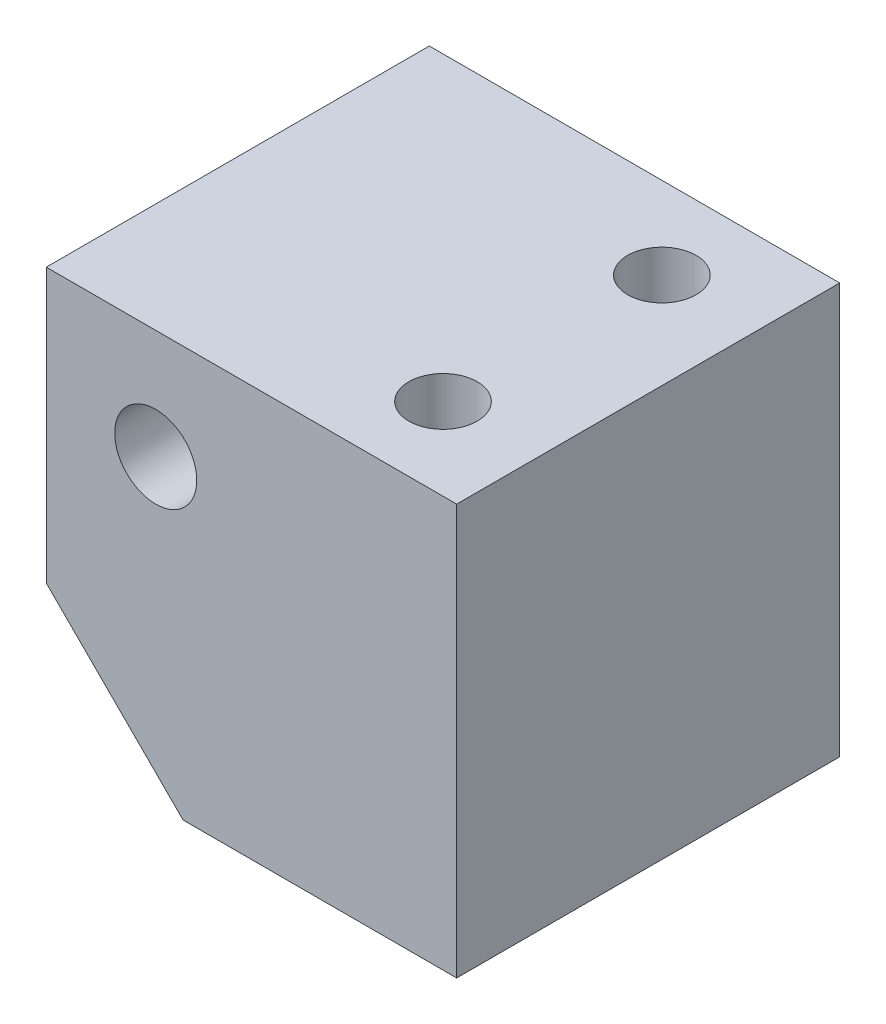
ISO-10303-21;
HEADER;
FILE_DESCRIPTION(('STEP AP214'),'2;1');
FILE_NAME('part.step','',(''),(''),'','','');
FILE_SCHEMA(('AUTOMOTIVE_DESIGN { 1 0 10303 214 1 1 1 1 }'));
ENDSEC;
DATA;
#1=APPLICATION_CONTEXT('core data for automotive mechanical design processes');
#2=APPLICATION_PROTOCOL_DEFINITION('international standard','automotive_design',2000,#1);
#3=PRODUCT_CONTEXT('',#1,'mechanical');
#4=PRODUCT('Part','Part','',(#3));
#5=PRODUCT_RELATED_PRODUCT_CATEGORY('part','',(#4));
#6=PRODUCT_DEFINITION_FORMATION('','',#4);
#7=PRODUCT_DEFINITION_CONTEXT('part definition',#1,'design');
#8=PRODUCT_DEFINITION('design','',#6,#7);
#9=PRODUCT_DEFINITION_SHAPE('','',#8);
#10=(LENGTH_UNIT() NAMED_UNIT(*) SI_UNIT(.MILLI.,.METRE.));
#11=(NAMED_UNIT(*) PLANE_ANGLE_UNIT() SI_UNIT($,.RADIAN.));
#12=(NAMED_UNIT(*) SI_UNIT($,.STERADIAN.) SOLID_ANGLE_UNIT());
#13=UNCERTAINTY_MEASURE_WITH_UNIT(LENGTH_MEASURE(1.E-05),#10,'distance_accuracy_value','');
#14=(GEOMETRIC_REPRESENTATION_CONTEXT(3) GLOBAL_UNCERTAINTY_ASSIGNED_CONTEXT((#13)) GLOBAL_UNIT_ASSIGNED_CONTEXT((#10,
#11,#12)) REPRESENTATION_CONTEXT('',''));
#15=CARTESIAN_POINT('',(0.,0.,0.));
#16=DIRECTION('',(0.,0.,1.));
#17=DIRECTION('',(1.,0.,0.));
#18=AXIS2_PLACEMENT_3D('',#15,#16,#17);
#19=CARTESIAN_POINT('',(-7.5,-7.5,14.));
#20=DIRECTION('',(0.707106781186548,0.707106781186548,0.));
#21=DIRECTION('',(-0.707106781186548,0.707106781186547,0.));
#22=AXIS2_PLACEMENT_3D('',#19,#20,#21);
#23=PLANE('',#22);
#24=DIRECTION('',(0.707106781186548,-0.707106781186547,0.));
#25=VECTOR('',#24,1.);
#26=CARTESIAN_POINT('',(-7.5,-7.5,0.));
#27=LINE('',#26,#25);
#28=CARTESIAN_POINT('',(-5.,-10.,0.));
#29=VERTEX_POINT('',#28);
#30=CARTESIAN_POINT('',(0.,-15.,0.));
#31=VERTEX_POINT('',#30);
#32=EDGE_CURVE('E116',#29,#31,#27,.T.);
#33=ORIENTED_EDGE('',*,*,#32,.T.);
#34=DIRECTION('',(0.,0.,-1.));
#35=VECTOR('',#34,1.);
#36=CARTESIAN_POINT('',(0.,-15.,14.));
#37=LINE('',#36,#35);
#38=CARTESIAN_POINT('',(0.,-15.,14.));
#39=VERTEX_POINT('',#38);
#40=EDGE_CURVE('E11',#39,#31,#37,.T.);
#41=ORIENTED_EDGE('',*,*,#40,.F.);
#42=DIRECTION('',(0.707106781186548,-0.707106781186547,0.));
#43=VECTOR('',#42,1.);
#44=CARTESIAN_POINT('',(-7.5,-7.5,14.));
#45=LINE('',#44,#43);
#46=CARTESIAN_POINT('',(-5.,-10.,14.));
#47=VERTEX_POINT('',#46);
#48=EDGE_CURVE('E130',#47,#39,#45,.T.);
#49=ORIENTED_EDGE('',*,*,#48,.F.);
#50=DIRECTION('',(0.,0.,-1.));
#51=VECTOR('',#50,1.);
#52=CARTESIAN_POINT('',(-5.,-10.,14.));
#53=LINE('',#52,#51);
#54=EDGE_CURVE('E115',#47,#29,#53,.T.);
#55=ORIENTED_EDGE('',*,*,#54,.T.);
#56=EDGE_LOOP('',(#33,#41,#49,#55));
#57=FACE_BOUND('',#56,.T.);
#58=ADVANCED_FACE('F40',(#57),#23,.F.);
#59=CARTESIAN_POINT('',(0.,-15.,14.));
#60=DIRECTION('',(0.,1.,0.));
#61=DIRECTION('',(0.,0.,1.));
#62=AXIS2_PLACEMENT_3D('',#59,#60,#61);
#63=PLANE('',#62);
#64=CARTESIAN_POINT('',(6.5,-15.,11.));
#65=DIRECTION('',(0.,1.,0.));
#66=DIRECTION('',(0.,0.,1.));
#67=AXIS2_PLACEMENT_3D('',#64,#65,#66);
#68=CIRCLE('',#67,1.25);
#69=CARTESIAN_POINT('',(6.5,-15.,12.25));
#70=VERTEX_POINT('',#69);
#71=EDGE_CURVE('E164',#70,#70,#68,.F.);
#72=ORIENTED_EDGE('',*,*,#71,.F.);
#73=EDGE_LOOP('',(#72));
#74=FACE_BOUND('',#73,.T.);
#75=CARTESIAN_POINT('',(6.5,-15.,3.));
#76=DIRECTION('',(0.,1.,0.));
#77=DIRECTION('',(0.,0.,1.));
#78=AXIS2_PLACEMENT_3D('',#75,#76,#77);
#79=CIRCLE('',#78,1.25);
#80=CARTESIAN_POINT('',(6.5,-15.,4.25));
#81=VERTEX_POINT('',#80);
#82=EDGE_CURVE('E120',#81,#81,#79,.F.);
#83=ORIENTED_EDGE('',*,*,#82,.F.);
#84=EDGE_LOOP('',(#83));
#85=FACE_BOUND('',#84,.T.);
#86=DIRECTION('',(1.,0.,0.));
#87=VECTOR('',#86,1.);
#88=CARTESIAN_POINT('',(0.,-15.,0.));
#89=LINE('',#88,#87);
#90=CARTESIAN_POINT('',(10.,-15.,0.));
#91=VERTEX_POINT('',#90);
#92=EDGE_CURVE('E119',#31,#91,#89,.T.);
#93=ORIENTED_EDGE('',*,*,#92,.T.);
#94=DIRECTION('',(0.,0.,-1.));
#95=VECTOR('',#94,1.);
#96=CARTESIAN_POINT('',(10.,-15.,14.));
#97=LINE('',#96,#95);
#98=CARTESIAN_POINT('',(10.,-15.,14.));
#99=VERTEX_POINT('',#98);
#100=EDGE_CURVE('E48',#99,#91,#97,.T.);
#101=ORIENTED_EDGE('',*,*,#100,.F.);
#102=DIRECTION('',(1.,0.,0.));
#103=VECTOR('',#102,1.);
#104=CARTESIAN_POINT('',(0.,-15.,14.));
#105=LINE('',#104,#103);
#106=EDGE_CURVE('E86',#39,#99,#105,.T.);
#107=ORIENTED_EDGE('',*,*,#106,.F.);
#108=ORIENTED_EDGE('',*,*,#40,.T.);
#109=EDGE_LOOP('',(#93,#101,#107,#108));
#110=FACE_BOUND('',#109,.T.);
#111=ADVANCED_FACE('F132',(#74,#85,#110),#63,.F.);
#112=CARTESIAN_POINT('',(10.,0.,14.));
#113=DIRECTION('',(1.,0.,0.));
#114=DIRECTION('',(0.,1.,0.));
#115=AXIS2_PLACEMENT_3D('',#112,#113,#114);
#116=PLANE('',#115);
#117=DIRECTION('',(0.,-1.,0.));
#118=VECTOR('',#117,1.);
#119=CARTESIAN_POINT('',(10.,0.,0.));
#120=LINE('',#119,#118);
#121=CARTESIAN_POINT('',(10.,0.,0.));
#122=VERTEX_POINT('',#121);
#123=EDGE_CURVE('E97',#122,#91,#120,.T.);
#124=ORIENTED_EDGE('',*,*,#123,.F.);
#125=DIRECTION('',(0.,0.,-1.));
#126=VECTOR('',#125,1.);
#127=CARTESIAN_POINT('',(10.,0.,14.));
#128=LINE('',#127,#126);
#129=CARTESIAN_POINT('',(10.,0.,14.));
#130=VERTEX_POINT('',#129);
#131=EDGE_CURVE('E92',#130,#122,#128,.T.);
#132=ORIENTED_EDGE('',*,*,#131,.F.);
#133=DIRECTION('',(0.,-1.,0.));
#134=VECTOR('',#133,1.);
#135=CARTESIAN_POINT('',(10.,0.,14.));
#136=LINE('',#135,#134);
#137=EDGE_CURVE('E95',#130,#99,#136,.T.);
#138=ORIENTED_EDGE('',*,*,#137,.T.);
#139=ORIENTED_EDGE('',*,*,#100,.T.);
#140=EDGE_LOOP('',(#124,#132,#138,#139));
#141=FACE_BOUND('',#140,.T.);
#142=ADVANCED_FACE('F94',(#141),#116,.T.);
#143=CARTESIAN_POINT('',(0.,0.,14.));
#144=DIRECTION('',(0.,1.,0.));
#145=DIRECTION('',(0.,0.,1.));
#146=AXIS2_PLACEMENT_3D('',#143,#144,#145);
#147=PLANE('',#146);
#148=CARTESIAN_POINT('',(6.5,0.,11.));
#149=DIRECTION('',(0.,1.,0.));
#150=DIRECTION('',(0.,0.,1.));
#151=AXIS2_PLACEMENT_3D('',#148,#149,#150);
#152=CIRCLE('',#151,1.25);
#153=CARTESIAN_POINT('',(6.5,0.,12.25));
#154=VERTEX_POINT('',#153);
#155=EDGE_CURVE('E175',#154,#154,#152,.T.);
#156=ORIENTED_EDGE('',*,*,#155,.F.);
#157=EDGE_LOOP('',(#156));
#158=FACE_BOUND('',#157,.T.);
#159=CARTESIAN_POINT('',(6.5,0.,3.));
#160=DIRECTION('',(0.,1.,0.));
#161=DIRECTION('',(0.,0.,1.));
#162=AXIS2_PLACEMENT_3D('',#159,#160,#161);
#163=CIRCLE('',#162,1.25);
#164=CARTESIAN_POINT('',(6.5,0.,4.25));
#165=VERTEX_POINT('',#164);
#166=EDGE_CURVE('E168',#165,#165,#163,.T.);
#167=ORIENTED_EDGE('',*,*,#166,.F.);
#168=EDGE_LOOP('',(#167));
#169=FACE_BOUND('',#168,.T.);
#170=DIRECTION('',(1.,0.,0.));
#171=VECTOR('',#170,1.);
#172=CARTESIAN_POINT('',(0.,0.,0.));
#173=LINE('',#172,#171);
#174=CARTESIAN_POINT('',(-5.,0.,0.));
#175=VERTEX_POINT('',#174);
#176=EDGE_CURVE('E124',#175,#122,#173,.T.);
#177=ORIENTED_EDGE('',*,*,#176,.F.);
#178=DIRECTION('',(0.,0.,-1.));
#179=VECTOR('',#178,1.);
#180=CARTESIAN_POINT('',(-5.,0.,14.));
#181=LINE('',#180,#179);
#182=CARTESIAN_POINT('',(-5.,0.,14.));
#183=VERTEX_POINT('',#182);
#184=EDGE_CURVE('E75',#183,#175,#181,.T.);
#185=ORIENTED_EDGE('',*,*,#184,.F.);
#186=DIRECTION('',(1.,0.,0.));
#187=VECTOR('',#186,1.);
#188=CARTESIAN_POINT('',(0.,0.,14.));
#189=LINE('',#188,#187);
#190=EDGE_CURVE('E105',#183,#130,#189,.T.);
#191=ORIENTED_EDGE('',*,*,#190,.T.);
#192=ORIENTED_EDGE('',*,*,#131,.T.);
#193=EDGE_LOOP('',(#177,#185,#191,#192));
#194=FACE_BOUND('',#193,.T.);
#195=ADVANCED_FACE('F107',(#158,#169,#194),#147,.T.);
#196=CARTESIAN_POINT('',(-5.,0.,14.));
#197=DIRECTION('',(1.,0.,0.));
#198=DIRECTION('',(0.,1.,0.));
#199=AXIS2_PLACEMENT_3D('',#196,#197,#198);
#200=PLANE('',#199);
#201=DIRECTION('',(0.,-1.,0.));
#202=VECTOR('',#201,1.);
#203=CARTESIAN_POINT('',(-5.,0.,0.));
#204=LINE('',#203,#202);
#205=EDGE_CURVE('E78',#175,#29,#204,.T.);
#206=ORIENTED_EDGE('',*,*,#205,.T.);
#207=ORIENTED_EDGE('',*,*,#54,.F.);
#208=DIRECTION('',(0.,-1.,0.));
#209=VECTOR('',#208,1.);
#210=CARTESIAN_POINT('',(-5.,0.,14.));
#211=LINE('',#210,#209);
#212=EDGE_CURVE('E56',#183,#47,#211,.T.);
#213=ORIENTED_EDGE('',*,*,#212,.F.);
#214=ORIENTED_EDGE('',*,*,#184,.T.);
#215=EDGE_LOOP('',(#206,#207,#213,#214));
#216=FACE_BOUND('',#215,.T.);
#217=ADVANCED_FACE('F140',(#216),#200,.F.);
#218=CARTESIAN_POINT('',(-1.,-4.,14.));
#219=DIRECTION('',(0.,0.,-1.));
#220=DIRECTION('',(-1.,0.,0.));
#221=AXIS2_PLACEMENT_3D('',#218,#219,#220);
#222=CYLINDRICAL_SURFACE('',#221,1.5);
#223=CARTESIAN_POINT('',(-1.,-4.,14.));
#224=DIRECTION('',(0.,0.,1.));
#225=DIRECTION('',(1.,0.,0.));
#226=AXIS2_PLACEMENT_3D('',#223,#224,#225);
#227=CIRCLE('',#226,1.5);
#228=CARTESIAN_POINT('',(0.5,-4.,14.));
#229=VERTEX_POINT('',#228);
#230=EDGE_CURVE('E109',#229,#229,#227,.T.);
#231=ORIENTED_EDGE('',*,*,#230,.T.);
#232=EDGE_LOOP('',(#231));
#233=FACE_BOUND('',#232,.T.);
#234=CARTESIAN_POINT('',(-1.,-4.,0.));
#235=DIRECTION('',(0.,0.,1.));
#236=DIRECTION('',(1.,0.,0.));
#237=AXIS2_PLACEMENT_3D('',#234,#235,#236);
#238=CIRCLE('',#237,1.5);
#239=CARTESIAN_POINT('',(0.5,-4.,0.));
#240=VERTEX_POINT('',#239);
#241=EDGE_CURVE('E127',#240,#240,#238,.T.);
#242=ORIENTED_EDGE('',*,*,#241,.F.);
#243=EDGE_LOOP('',(#242));
#244=FACE_BOUND('',#243,.T.);
#245=ADVANCED_FACE('F142',(#233,#244),#222,.F.);
#246=CARTESIAN_POINT('',(0.,0.,14.));
#247=DIRECTION('',(0.,0.,1.));
#248=DIRECTION('',(1.,0.,0.));
#249=AXIS2_PLACEMENT_3D('',#246,#247,#248);
#250=PLANE('',#249);
#251=ORIENTED_EDGE('',*,*,#48,.T.);
#252=ORIENTED_EDGE('',*,*,#106,.T.);
#253=ORIENTED_EDGE('',*,*,#137,.F.);
#254=ORIENTED_EDGE('',*,*,#190,.F.);
#255=ORIENTED_EDGE('',*,*,#212,.T.);
#256=EDGE_LOOP('',(#251,#252,#253,#254,#255));
#257=FACE_BOUND('',#256,.T.);
#258=ORIENTED_EDGE('',*,*,#230,.F.);
#259=EDGE_LOOP('',(#258));
#260=FACE_BOUND('',#259,.T.);
#261=ADVANCED_FACE('F103',(#257,#260),#250,.T.);
#262=CARTESIAN_POINT('',(0.,0.,0.));
#263=DIRECTION('',(0.,0.,1.));
#264=DIRECTION('',(1.,0.,0.));
#265=AXIS2_PLACEMENT_3D('',#262,#263,#264);
#266=PLANE('',#265);
#267=ORIENTED_EDGE('',*,*,#32,.F.);
#268=ORIENTED_EDGE('',*,*,#205,.F.);
#269=ORIENTED_EDGE('',*,*,#176,.T.);
#270=ORIENTED_EDGE('',*,*,#123,.T.);
#271=ORIENTED_EDGE('',*,*,#92,.F.);
#272=EDGE_LOOP('',(#267,#268,#269,#270,#271));
#273=FACE_BOUND('',#272,.T.);
#274=ORIENTED_EDGE('',*,*,#241,.T.);
#275=EDGE_LOOP('',(#274));
#276=FACE_BOUND('',#275,.T.);
#277=ADVANCED_FACE('F136',(#273,#276),#266,.F.);
#278=CARTESIAN_POINT('',(6.5,-18.5355339059327,3.));
#279=DIRECTION('',(0.,1.,0.));
#280=DIRECTION('',(0.,0.,1.));
#281=AXIS2_PLACEMENT_3D('',#278,#279,#280);
#282=CYLINDRICAL_SURFACE('',#281,1.25);
#283=ORIENTED_EDGE('',*,*,#82,.T.);
#284=EDGE_LOOP('',(#283));
#285=FACE_BOUND('',#284,.T.);
#286=ORIENTED_EDGE('',*,*,#166,.T.);
#287=EDGE_LOOP('',(#286));
#288=FACE_BOUND('',#287,.T.);
#289=ADVANCED_FACE('F183',(#285,#288),#282,.F.);
#290=CARTESIAN_POINT('',(6.5,-18.5355339059327,11.));
#291=DIRECTION('',(0.,1.,0.));
#292=DIRECTION('',(0.,0.,1.));
#293=AXIS2_PLACEMENT_3D('',#290,#291,#292);
#294=CYLINDRICAL_SURFACE('',#293,1.25);
#295=ORIENTED_EDGE('',*,*,#71,.T.);
#296=EDGE_LOOP('',(#295));
#297=FACE_BOUND('',#296,.T.);
#298=ORIENTED_EDGE('',*,*,#155,.T.);
#299=EDGE_LOOP('',(#298));
#300=FACE_BOUND('',#299,.T.);
#301=ADVANCED_FACE('F179',(#297,#300),#294,.F.);
#302=CLOSED_SHELL('',(#58,#111,#142,#195,#217,#245,#261,#277,#289,#301));
#303=MANIFOLD_SOLID_BREP('B2',#302);
#304=ADVANCED_BREP_SHAPE_REPRESENTATION('',(#18,#303),#14);
#305=SHAPE_DEFINITION_REPRESENTATION(#9,#304);
ENDSEC;
END-ISO-10303-21;
